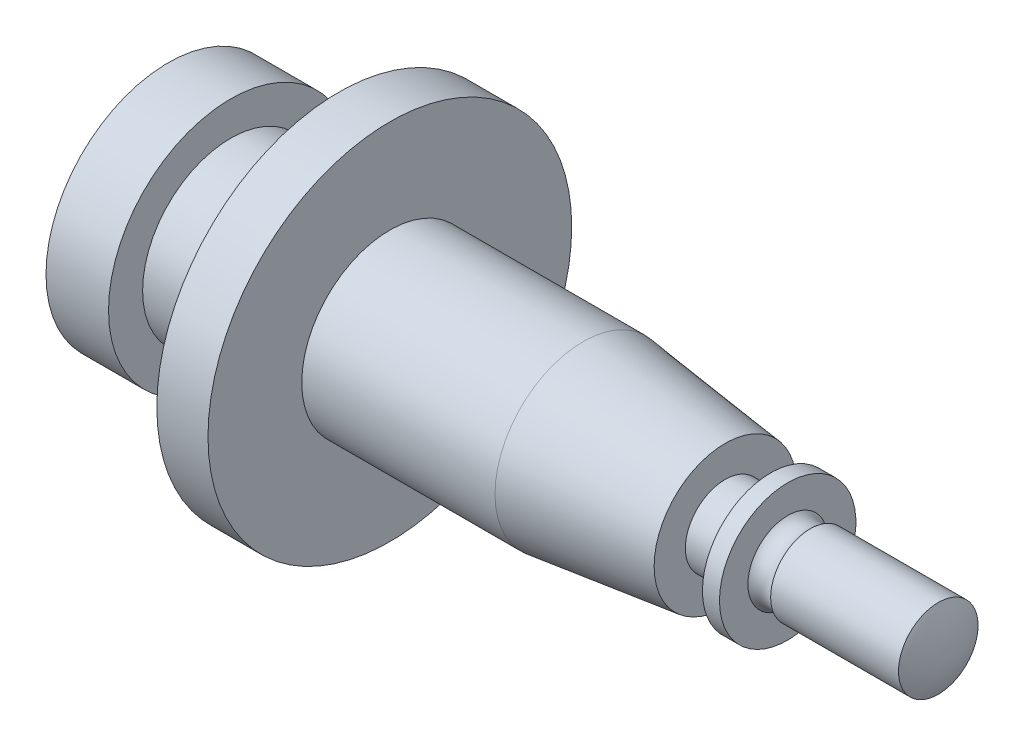
ISO-10303-21;
HEADER;
FILE_DESCRIPTION(('STEP AP214'),'2;1');
FILE_NAME('part.step','',(''),(''),'','','');
FILE_SCHEMA(('AUTOMOTIVE_DESIGN { 1 0 10303 214 1 1 1 1 }'));
ENDSEC;
DATA;
#1=APPLICATION_CONTEXT('core data for automotive mechanical design processes');
#2=APPLICATION_PROTOCOL_DEFINITION('international standard','automotive_design',2000,#1);
#3=PRODUCT_CONTEXT('',#1,'mechanical');
#4=PRODUCT('Part','Part','',(#3));
#5=PRODUCT_RELATED_PRODUCT_CATEGORY('part','',(#4));
#6=PRODUCT_DEFINITION_FORMATION('','',#4);
#7=PRODUCT_DEFINITION_CONTEXT('part definition',#1,'design');
#8=PRODUCT_DEFINITION('design','',#6,#7);
#9=PRODUCT_DEFINITION_SHAPE('','',#8);
#10=(LENGTH_UNIT() NAMED_UNIT(*) SI_UNIT(.MILLI.,.METRE.));
#11=(NAMED_UNIT(*) PLANE_ANGLE_UNIT() SI_UNIT($,.RADIAN.));
#12=(NAMED_UNIT(*) SI_UNIT($,.STERADIAN.) SOLID_ANGLE_UNIT());
#13=UNCERTAINTY_MEASURE_WITH_UNIT(LENGTH_MEASURE(1.E-05),#10,'distance_accuracy_value','');
#14=(GEOMETRIC_REPRESENTATION_CONTEXT(3) GLOBAL_UNCERTAINTY_ASSIGNED_CONTEXT((#13)) GLOBAL_UNIT_ASSIGNED_CONTEXT((#10,
#11,#12)) REPRESENTATION_CONTEXT('',''));
#15=CARTESIAN_POINT('',(0.,0.,0.));
#16=DIRECTION('',(0.,0.,1.));
#17=DIRECTION('',(1.,0.,0.));
#18=AXIS2_PLACEMENT_3D('',#15,#16,#17);
#19=CARTESIAN_POINT('',(122.006687491334,0.,0.447861605285924));
#20=DIRECTION('',(0.,-1.,0.));
#21=DIRECTION('',(0.,0.,1.));
#22=AXIS2_PLACEMENT_3D('',#19,#20,#21);
#23=CIRCLE('',#22,15.);
#24=TRIMMED_CURVE('',#23,(PARAMETER_VALUE(-1.60065820508037)),
(PARAMETER_VALUE(1.60065820508037)),.T.,.PARAMETER.);
#25=CARTESIAN_POINT('',(122.006687491334,0.,0.));
#26=DIRECTION('',(-1.,0.,0.));
#27=AXIS1_PLACEMENT('',#25,#26);
#28=SURFACE_OF_REVOLUTION('',#24,#27);
#29=CARTESIAN_POINT('',(135.5,0.,0.));
#30=DIRECTION('',(-1.,0.,0.));
#31=DIRECTION('',(0.,0.,1.));
#32=AXIS2_PLACEMENT_3D('',#29,#30,#31);
#33=CIRCLE('',#32,7.);
#34=CARTESIAN_POINT('',(135.5,0.,7.));
#35=VERTEX_POINT('',#34);
#36=EDGE_CURVE('E11',#35,#35,#33,.T.);
#37=ORIENTED_EDGE('',*,*,#36,.F.);
#38=EDGE_LOOP('',(#37));
#39=FACE_BOUND('',#38,.T.);
#40=CARTESIAN_POINT('',(137.,0.,0.));
#41=VERTEX_POINT('',#40);
#42=VERTEX_LOOP('',#41);
#43=FACE_BOUND('',#42,.T.);
#44=ADVANCED_FACE('F44',(#39,#43),#28,.T.);
#45=CARTESIAN_POINT('',(0.,0.,0.));
#46=DIRECTION('',(-1.,0.,0.));
#47=DIRECTION('',(0.,0.,1.));
#48=AXIS2_PLACEMENT_3D('',#45,#46,#47);
#49=CYLINDRICAL_SURFACE('',#48,7.);
#50=CARTESIAN_POINT('',(113.,0.,0.));
#51=DIRECTION('',(-1.,0.,0.));
#52=DIRECTION('',(0.,0.,1.));
#53=AXIS2_PLACEMENT_3D('',#50,#51,#52);
#54=CIRCLE('',#53,7.);
#55=CARTESIAN_POINT('',(113.,0.,7.));
#56=VERTEX_POINT('',#55);
#57=EDGE_CURVE('E55',#56,#56,#54,.T.);
#58=ORIENTED_EDGE('',*,*,#57,.F.);
#59=EDGE_LOOP('',(#58));
#60=FACE_BOUND('',#59,.T.);
#61=ORIENTED_EDGE('',*,*,#36,.T.);
#62=EDGE_LOOP('',(#61));
#63=FACE_BOUND('',#62,.T.);
#64=ADVANCED_FACE('F57',(#60,#63),#49,.T.);
#65=CARTESIAN_POINT('',(111.,0.,0.));
#66=DIRECTION('',(-1.,0.,0.));
#67=DIRECTION('',(0.,0.,1.));
#68=AXIS2_PLACEMENT_3D('',#65,#66,#67);
#69=TOROIDAL_SURFACE('',#68,9.23606797749979,3.);
#70=CARTESIAN_POINT('',(109.,0.,0.));
#71=DIRECTION('',(-1.,0.,0.));
#72=DIRECTION('',(0.,0.,1.));
#73=AXIS2_PLACEMENT_3D('',#70,#71,#72);
#74=CIRCLE('',#73,7.);
#75=CARTESIAN_POINT('',(109.,0.,7.));
#76=VERTEX_POINT('',#75);
#77=EDGE_CURVE('E181',#76,#76,#74,.T.);
#78=ORIENTED_EDGE('',*,*,#77,.F.);
#79=EDGE_LOOP('',(#78));
#80=FACE_BOUND('',#79,.T.);
#81=ORIENTED_EDGE('',*,*,#57,.T.);
#82=EDGE_LOOP('',(#81));
#83=FACE_BOUND('',#82,.T.);
#84=ADVANCED_FACE('F62',(#80,#83),#69,.F.);
#85=CARTESIAN_POINT('',(109.,12.,0.));
#86=DIRECTION('',(-1.,0.,0.));
#87=DIRECTION('',(0.,0.,1.));
#88=AXIS2_PLACEMENT_3D('',#85,#86,#87);
#89=PLANE('',#88);
#90=CARTESIAN_POINT('',(109.,0.,0.));
#91=DIRECTION('',(-1.,0.,0.));
#92=DIRECTION('',(0.,0.,1.));
#93=AXIS2_PLACEMENT_3D('',#90,#91,#92);
#94=CIRCLE('',#93,12.);
#95=CARTESIAN_POINT('',(109.,0.,12.));
#96=VERTEX_POINT('',#95);
#97=EDGE_CURVE('E177',#96,#96,#94,.T.);
#98=ORIENTED_EDGE('',*,*,#97,.F.);
#99=EDGE_LOOP('',(#98));
#100=FACE_BOUND('',#99,.T.);
#101=ORIENTED_EDGE('',*,*,#77,.T.);
#102=EDGE_LOOP('',(#101));
#103=FACE_BOUND('',#102,.T.);
#104=ADVANCED_FACE('F68',(#100,#103),#89,.F.);
#105=CARTESIAN_POINT('',(0.,0.,0.));
#106=DIRECTION('',(-1.,0.,0.));
#107=DIRECTION('',(0.,0.,1.));
#108=AXIS2_PLACEMENT_3D('',#105,#106,#107);
#109=CYLINDRICAL_SURFACE('',#108,12.);
#110=CARTESIAN_POINT('',(106.,0.,0.));
#111=DIRECTION('',(-1.,0.,0.));
#112=DIRECTION('',(0.,0.,1.));
#113=AXIS2_PLACEMENT_3D('',#110,#111,#112);
#114=CIRCLE('',#113,12.);
#115=CARTESIAN_POINT('',(106.,0.,12.));
#116=VERTEX_POINT('',#115);
#117=EDGE_CURVE('E173',#116,#116,#114,.T.);
#118=ORIENTED_EDGE('',*,*,#117,.F.);
#119=EDGE_LOOP('',(#118));
#120=FACE_BOUND('',#119,.T.);
#121=ORIENTED_EDGE('',*,*,#97,.T.);
#122=EDGE_LOOP('',(#121));
#123=FACE_BOUND('',#122,.T.);
#124=ADVANCED_FACE('F73',(#120,#123),#109,.T.);
#125=CARTESIAN_POINT('',(106.,7.,0.));
#126=DIRECTION('',(1.,0.,0.));
#127=DIRECTION('',(0.,0.,-1.));
#128=AXIS2_PLACEMENT_3D('',#125,#126,#127);
#129=PLANE('',#128);
#130=CARTESIAN_POINT('',(106.,0.,0.));
#131=DIRECTION('',(-1.,0.,0.));
#132=DIRECTION('',(0.,0.,1.));
#133=AXIS2_PLACEMENT_3D('',#130,#131,#132);
#134=CIRCLE('',#133,7.);
#135=CARTESIAN_POINT('',(106.,0.,7.));
#136=VERTEX_POINT('',#135);
#137=EDGE_CURVE('E172',#136,#136,#134,.T.);
#138=ORIENTED_EDGE('',*,*,#137,.F.);
#139=EDGE_LOOP('',(#138));
#140=FACE_BOUND('',#139,.T.);
#141=ORIENTED_EDGE('',*,*,#117,.T.);
#142=EDGE_LOOP('',(#141));
#143=FACE_BOUND('',#142,.T.);
#144=ADVANCED_FACE('F76',(#140,#143),#129,.F.);
#145=CARTESIAN_POINT('',(0.,0.,0.));
#146=DIRECTION('',(-1.,0.,0.));
#147=DIRECTION('',(0.,0.,1.));
#148=AXIS2_PLACEMENT_3D('',#145,#146,#147);
#149=CYLINDRICAL_SURFACE('',#148,7.);
#150=CARTESIAN_POINT('',(98.,0.,0.));
#151=DIRECTION('',(-1.,0.,0.));
#152=DIRECTION('',(0.,0.,1.));
#153=AXIS2_PLACEMENT_3D('',#150,#151,#152);
#154=CIRCLE('',#153,7.);
#155=CARTESIAN_POINT('',(98.,0.,7.));
#156=VERTEX_POINT('',#155);
#157=EDGE_CURVE('E170',#156,#156,#154,.T.);
#158=ORIENTED_EDGE('',*,*,#157,.F.);
#159=EDGE_LOOP('',(#158));
#160=FACE_BOUND('',#159,.T.);
#161=ORIENTED_EDGE('',*,*,#137,.T.);
#162=EDGE_LOOP('',(#161));
#163=FACE_BOUND('',#162,.T.);
#164=ADVANCED_FACE('F83',(#160,#163),#149,.T.);
#165=CARTESIAN_POINT('',(98.,12.5,0.));
#166=DIRECTION('',(-1.,0.,0.));
#167=DIRECTION('',(0.,0.,1.));
#168=AXIS2_PLACEMENT_3D('',#165,#166,#167);
#169=PLANE('',#168);
#170=CARTESIAN_POINT('',(98.,0.,0.));
#171=DIRECTION('',(-1.,0.,0.));
#172=DIRECTION('',(0.,0.,1.));
#173=AXIS2_PLACEMENT_3D('',#170,#171,#172);
#174=CIRCLE('',#173,12.5);
#175=CARTESIAN_POINT('',(98.,0.,12.5));
#176=VERTEX_POINT('',#175);
#177=EDGE_CURVE('E162',#176,#176,#174,.T.);
#178=ORIENTED_EDGE('',*,*,#177,.F.);
#179=EDGE_LOOP('',(#178));
#180=FACE_BOUND('',#179,.T.);
#181=ORIENTED_EDGE('',*,*,#157,.T.);
#182=EDGE_LOOP('',(#181));
#183=FACE_BOUND('',#182,.T.);
#184=ADVANCED_FACE('F87',(#180,#183),#169,.F.);
#185=CARTESIAN_POINT('',(98.,0.,0.));
#186=DIRECTION('',(-1.,0.,0.));
#187=DIRECTION('',(0.,0.,1.));
#188=AXIS2_PLACEMENT_3D('',#185,#186,#187);
#189=CONICAL_SURFACE('',#188,12.5,0.119428926018338);
#190=CARTESIAN_POINT('',(73.,0.,0.));
#191=DIRECTION('',(-1.,0.,0.));
#192=DIRECTION('',(0.,0.,1.));
#193=AXIS2_PLACEMENT_3D('',#190,#191,#192);
#194=CIRCLE('',#193,15.5);
#195=CARTESIAN_POINT('',(73.,0.,15.5));
#196=VERTEX_POINT('',#195);
#197=EDGE_CURVE('E157',#196,#196,#194,.T.);
#198=ORIENTED_EDGE('',*,*,#197,.F.);
#199=EDGE_LOOP('',(#198));
#200=FACE_BOUND('',#199,.T.);
#201=ORIENTED_EDGE('',*,*,#177,.T.);
#202=EDGE_LOOP('',(#201));
#203=FACE_BOUND('',#202,.T.);
#204=ADVANCED_FACE('F93',(#200,#203),#189,.T.);
#205=CARTESIAN_POINT('',(0.,0.,0.));
#206=DIRECTION('',(-1.,0.,0.));
#207=DIRECTION('',(0.,0.,1.));
#208=AXIS2_PLACEMENT_3D('',#205,#206,#207);
#209=CYLINDRICAL_SURFACE('',#208,15.5);
#210=CARTESIAN_POINT('',(39.,0.,0.));
#211=DIRECTION('',(-1.,0.,0.));
#212=DIRECTION('',(0.,0.,1.));
#213=AXIS2_PLACEMENT_3D('',#210,#211,#212);
#214=CIRCLE('',#213,15.5);
#215=CARTESIAN_POINT('',(39.,0.,15.5));
#216=VERTEX_POINT('',#215);
#217=EDGE_CURVE('E154',#216,#216,#214,.T.);
#218=ORIENTED_EDGE('',*,*,#217,.F.);
#219=EDGE_LOOP('',(#218));
#220=FACE_BOUND('',#219,.T.);
#221=ORIENTED_EDGE('',*,*,#197,.T.);
#222=EDGE_LOOP('',(#221));
#223=FACE_BOUND('',#222,.T.);
#224=ADVANCED_FACE('F92',(#220,#223),#209,.T.);
#225=CARTESIAN_POINT('',(39.,32.,0.));
#226=DIRECTION('',(-1.,0.,0.));
#227=DIRECTION('',(0.,0.,1.));
#228=AXIS2_PLACEMENT_3D('',#225,#226,#227);
#229=PLANE('',#228);
#230=CARTESIAN_POINT('',(39.,0.,0.));
#231=DIRECTION('',(-1.,0.,0.));
#232=DIRECTION('',(0.,0.,1.));
#233=AXIS2_PLACEMENT_3D('',#230,#231,#232);
#234=CIRCLE('',#233,32.);
#235=CARTESIAN_POINT('',(39.,0.,32.));
#236=VERTEX_POINT('',#235);
#237=EDGE_CURVE('E151',#236,#236,#234,.T.);
#238=ORIENTED_EDGE('',*,*,#237,.F.);
#239=EDGE_LOOP('',(#238));
#240=FACE_BOUND('',#239,.T.);
#241=ORIENTED_EDGE('',*,*,#217,.T.);
#242=EDGE_LOOP('',(#241));
#243=FACE_BOUND('',#242,.T.);
#244=ADVANCED_FACE('F97',(#240,#243),#229,.F.);
#245=CARTESIAN_POINT('',(0.,0.,0.));
#246=DIRECTION('',(-1.,0.,0.));
#247=DIRECTION('',(0.,0.,1.));
#248=AXIS2_PLACEMENT_3D('',#245,#246,#247);
#249=CYLINDRICAL_SURFACE('',#248,32.);
#250=CARTESIAN_POINT('',(30.,0.,0.));
#251=DIRECTION('',(-1.,0.,0.));
#252=DIRECTION('',(0.,0.,1.));
#253=AXIS2_PLACEMENT_3D('',#250,#251,#252);
#254=CIRCLE('',#253,32.);
#255=CARTESIAN_POINT('',(30.,0.,32.));
#256=VERTEX_POINT('',#255);
#257=EDGE_CURVE('E150',#256,#256,#254,.T.);
#258=ORIENTED_EDGE('',*,*,#257,.F.);
#259=EDGE_LOOP('',(#258));
#260=FACE_BOUND('',#259,.T.);
#261=ORIENTED_EDGE('',*,*,#237,.T.);
#262=EDGE_LOOP('',(#261));
#263=FACE_BOUND('',#262,.T.);
#264=ADVANCED_FACE('F103',(#260,#263),#249,.T.);
#265=CARTESIAN_POINT('',(30.,15.5,0.));
#266=DIRECTION('',(1.,0.,0.));
#267=DIRECTION('',(0.,0.,-1.));
#268=AXIS2_PLACEMENT_3D('',#265,#266,#267);
#269=PLANE('',#268);
#270=CARTESIAN_POINT('',(30.,0.,0.));
#271=DIRECTION('',(-1.,0.,0.));
#272=DIRECTION('',(0.,0.,1.));
#273=AXIS2_PLACEMENT_3D('',#270,#271,#272);
#274=CIRCLE('',#273,15.5);
#275=CARTESIAN_POINT('',(30.,0.,15.5));
#276=VERTEX_POINT('',#275);
#277=EDGE_CURVE('E141',#276,#276,#274,.T.);
#278=ORIENTED_EDGE('',*,*,#277,.F.);
#279=EDGE_LOOP('',(#278));
#280=FACE_BOUND('',#279,.T.);
#281=ORIENTED_EDGE('',*,*,#257,.T.);
#282=EDGE_LOOP('',(#281));
#283=FACE_BOUND('',#282,.T.);
#284=ADVANCED_FACE('F110',(#280,#283),#269,.F.);
#285=CARTESIAN_POINT('',(0.,0.,0.));
#286=DIRECTION('',(-1.,0.,0.));
#287=DIRECTION('',(0.,0.,1.));
#288=AXIS2_PLACEMENT_3D('',#285,#286,#287);
#289=CYLINDRICAL_SURFACE('',#288,15.5);
#290=CARTESIAN_POINT('',(11.,0.,0.));
#291=DIRECTION('',(-1.,0.,0.));
#292=DIRECTION('',(0.,0.,1.));
#293=AXIS2_PLACEMENT_3D('',#290,#291,#292);
#294=CIRCLE('',#293,15.5);
#295=CARTESIAN_POINT('',(11.,0.,15.5));
#296=VERTEX_POINT('',#295);
#297=EDGE_CURVE('E140',#296,#296,#294,.T.);
#298=ORIENTED_EDGE('',*,*,#297,.F.);
#299=EDGE_LOOP('',(#298));
#300=FACE_BOUND('',#299,.T.);
#301=ORIENTED_EDGE('',*,*,#277,.T.);
#302=EDGE_LOOP('',(#301));
#303=FACE_BOUND('',#302,.T.);
#304=ADVANCED_FACE('F112',(#300,#303),#289,.T.);
#305=CARTESIAN_POINT('',(11.,21.5,0.));
#306=DIRECTION('',(-1.,0.,0.));
#307=DIRECTION('',(0.,0.,1.));
#308=AXIS2_PLACEMENT_3D('',#305,#306,#307);
#309=PLANE('',#308);
#310=CARTESIAN_POINT('',(11.,0.,0.));
#311=DIRECTION('',(-1.,0.,0.));
#312=DIRECTION('',(0.,0.,1.));
#313=AXIS2_PLACEMENT_3D('',#310,#311,#312);
#314=CIRCLE('',#313,21.5);
#315=CARTESIAN_POINT('',(11.,0.,21.5));
#316=VERTEX_POINT('',#315);
#317=EDGE_CURVE('E134',#316,#316,#314,.T.);
#318=ORIENTED_EDGE('',*,*,#317,.F.);
#319=EDGE_LOOP('',(#318));
#320=FACE_BOUND('',#319,.T.);
#321=ORIENTED_EDGE('',*,*,#297,.T.);
#322=EDGE_LOOP('',(#321));
#323=FACE_BOUND('',#322,.T.);
#324=ADVANCED_FACE('F113',(#320,#323),#309,.F.);
#325=CARTESIAN_POINT('',(0.,0.,0.));
#326=DIRECTION('',(-1.,0.,0.));
#327=DIRECTION('',(0.,0.,1.));
#328=AXIS2_PLACEMENT_3D('',#325,#326,#327);
#329=CYLINDRICAL_SURFACE('',#328,21.5);
#330=CARTESIAN_POINT('',(0.,0.,0.));
#331=DIRECTION('',(-1.,0.,0.));
#332=DIRECTION('',(0.,0.,1.));
#333=AXIS2_PLACEMENT_3D('',#330,#331,#332);
#334=CIRCLE('',#333,21.5);
#335=CARTESIAN_POINT('',(0.,0.,21.5));
#336=VERTEX_POINT('',#335);
#337=EDGE_CURVE('E132',#336,#336,#334,.T.);
#338=ORIENTED_EDGE('',*,*,#337,.F.);
#339=EDGE_LOOP('',(#338));
#340=FACE_BOUND('',#339,.T.);
#341=ORIENTED_EDGE('',*,*,#317,.T.);
#342=EDGE_LOOP('',(#341));
#343=FACE_BOUND('',#342,.T.);
#344=ADVANCED_FACE('F116',(#340,#343),#329,.T.);
#345=CARTESIAN_POINT('',(0.,0.,0.));
#346=DIRECTION('',(1.,0.,0.));
#347=DIRECTION('',(0.,0.,-1.));
#348=AXIS2_PLACEMENT_3D('',#345,#346,#347);
#349=PLANE('',#348);
#350=ORIENTED_EDGE('',*,*,#337,.T.);
#351=EDGE_LOOP('',(#350));
#352=FACE_BOUND('',#351,.T.);
#353=ADVANCED_FACE('F123',(#352),#349,.F.);
#354=CLOSED_SHELL('',(#44,#64,#84,#104,#124,#144,#164,#184,#204,#224,#244,#264,#284,#304,#324,
#344,#353));
#355=MANIFOLD_SOLID_BREP('B2',#354);
#356=ADVANCED_BREP_SHAPE_REPRESENTATION('',(#18,#355),#14);
#357=SHAPE_DEFINITION_REPRESENTATION(#9,#356);
ENDSEC;
END-ISO-10303-21;
